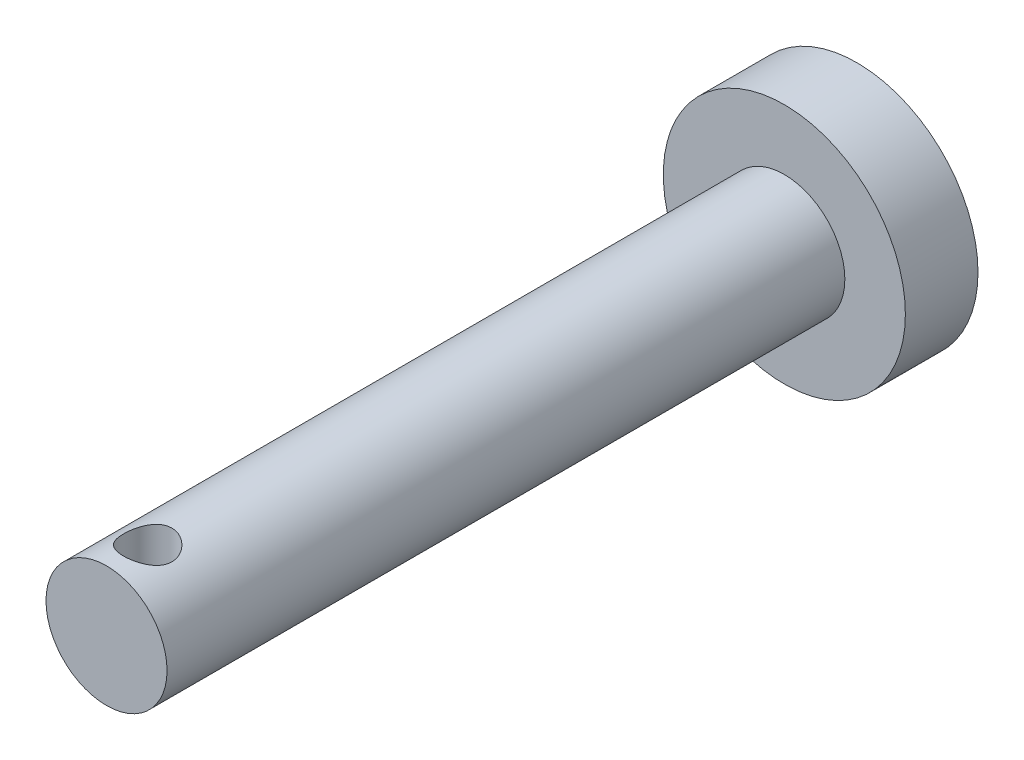
ISO-10303-21;
HEADER;
FILE_DESCRIPTION(('STEP AP214'),'2;1');
FILE_NAME('part.step','',(''),(''),'','','');
FILE_SCHEMA(('AUTOMOTIVE_DESIGN { 1 0 10303 214 1 1 1 1 }'));
ENDSEC;
DATA;
#1=APPLICATION_CONTEXT('core data for automotive mechanical design processes');
#2=APPLICATION_PROTOCOL_DEFINITION('international standard','automotive_design',2000,#1);
#3=PRODUCT_CONTEXT('',#1,'mechanical');
#4=PRODUCT('Part','Part','',(#3));
#5=PRODUCT_RELATED_PRODUCT_CATEGORY('part','',(#4));
#6=PRODUCT_DEFINITION_FORMATION('','',#4);
#7=PRODUCT_DEFINITION_CONTEXT('part definition',#1,'design');
#8=PRODUCT_DEFINITION('design','',#6,#7);
#9=PRODUCT_DEFINITION_SHAPE('','',#8);
#10=(LENGTH_UNIT() NAMED_UNIT(*) SI_UNIT(.MILLI.,.METRE.));
#11=(NAMED_UNIT(*) PLANE_ANGLE_UNIT() SI_UNIT($,.RADIAN.));
#12=(NAMED_UNIT(*) SI_UNIT($,.STERADIAN.) SOLID_ANGLE_UNIT());
#13=UNCERTAINTY_MEASURE_WITH_UNIT(LENGTH_MEASURE(1.E-05),#10,'distance_accuracy_value','');
#14=(GEOMETRIC_REPRESENTATION_CONTEXT(3) GLOBAL_UNCERTAINTY_ASSIGNED_CONTEXT((#13)) GLOBAL_UNIT_ASSIGNED_CONTEXT((#10,
#11,#12)) REPRESENTATION_CONTEXT('',''));
#15=CARTESIAN_POINT('',(0.,0.,0.));
#16=DIRECTION('',(0.,0.,1.));
#17=DIRECTION('',(1.,0.,0.));
#18=AXIS2_PLACEMENT_3D('',#15,#16,#17);
#19=CARTESIAN_POINT('',(0.,0.,-80.));
#20=DIRECTION('',(0.,0.,1.));
#21=DIRECTION('',(1.,0.,0.));
#22=AXIS2_PLACEMENT_3D('',#19,#20,#21);
#23=PLANE('',#22);
#24=CARTESIAN_POINT('',(0.,0.,-80.));
#25=DIRECTION('',(0.,0.,1.));
#26=DIRECTION('',(1.,0.,0.));
#27=AXIS2_PLACEMENT_3D('',#24,#25,#26);
#28=CIRCLE('',#27,5.);
#29=CARTESIAN_POINT('',(5.,0.,-80.));
#30=VERTEX_POINT('',#29);
#31=EDGE_CURVE('E10',#30,#30,#28,.T.);
#32=ORIENTED_EDGE('',*,*,#31,.F.);
#33=EDGE_LOOP('',(#32));
#34=FACE_BOUND('',#33,.T.);
#35=ADVANCED_FACE('F31',(#34),#23,.F.);
#36=CARTESIAN_POINT('',(0.,0.,80.));
#37=DIRECTION('',(0.,0.,1.));
#38=DIRECTION('',(1.,0.,0.));
#39=AXIS2_PLACEMENT_3D('',#36,#37,#38);
#40=CYLINDRICAL_SURFACE('',#39,5.);
#41=CARTESIAN_POINT('',(0.,0.,-77.));
#42=DIRECTION('',(0.,0.,1.));
#43=DIRECTION('',(1.,0.,0.));
#44=AXIS2_PLACEMENT_3D('',#41,#42,#43);
#45=CIRCLE('',#44,5.);
#46=CARTESIAN_POINT('',(5.,0.,-77.));
#47=VERTEX_POINT('',#46);
#48=EDGE_CURVE('E43',#47,#47,#45,.T.);
#49=ORIENTED_EDGE('',*,*,#48,.F.);
#50=EDGE_LOOP('',(#49));
#51=FACE_BOUND('',#50,.T.);
#52=ORIENTED_EDGE('',*,*,#31,.T.);
#53=EDGE_LOOP('',(#52));
#54=FACE_BOUND('',#53,.T.);
#55=ADVANCED_FACE('F79',(#51,#54),#40,.T.);
#56=CARTESIAN_POINT('',(0.,5.,-77.));
#57=DIRECTION('',(0.,0.,-1.));
#58=DIRECTION('',(-1.,0.,0.));
#59=AXIS2_PLACEMENT_3D('',#56,#57,#58);
#60=PLANE('',#59);
#61=CARTESIAN_POINT('',(0.,0.,-77.));
#62=DIRECTION('',(0.,0.,1.));
#63=DIRECTION('',(1.,0.,0.));
#64=AXIS2_PLACEMENT_3D('',#61,#62,#63);
#65=CIRCLE('',#64,2.50000000000002);
#66=CARTESIAN_POINT('',(2.50000000000002,0.,-77.));
#67=VERTEX_POINT('',#66);
#68=EDGE_CURVE('E48',#67,#67,#65,.T.);
#69=ORIENTED_EDGE('',*,*,#68,.F.);
#70=EDGE_LOOP('',(#69));
#71=FACE_BOUND('',#70,.T.);
#72=ORIENTED_EDGE('',*,*,#48,.T.);
#73=EDGE_LOOP('',(#72));
#74=FACE_BOUND('',#73,.T.);
#75=ADVANCED_FACE('F75',(#71,#74),#60,.F.);
#76=CARTESIAN_POINT('',(0.,0.,80.));
#77=DIRECTION('',(0.,0.,1.));
#78=DIRECTION('',(1.,0.,0.));
#79=AXIS2_PLACEMENT_3D('',#76,#77,#78);
#80=CYLINDRICAL_SURFACE('',#79,2.50000000000001);
#81=CARTESIAN_POINT('',(0.,-2.50000000000001,-49.7));
#82=CARTESIAN_POINT('',(0.0537465027214461,-2.49999635613543,-49.7000049259119));
#83=CARTESIAN_POINT('',(0.107586282045338,-2.49824647153467,-49.7043588760442));
#84=CARTESIAN_POINT('',(0.213748240208949,-2.49141726550322,-49.7216238517606));
#85=CARTESIAN_POINT('',(0.266065888780625,-2.4863288934944,-49.7345581395431));
#86=CARTESIAN_POINT('',(0.367476961363703,-2.4733710460656,-49.7684380390294));
#87=CARTESIAN_POINT('',(0.416580330808481,-2.46551068182037,-49.7893574231084));
#88=CARTESIAN_POINT('',(0.510535985164186,-2.4477830539804,-49.8385095866633));
#89=CARTESIAN_POINT('',(0.555389738375498,-2.43791648729029,-49.8667398274595));
#90=CARTESIAN_POINT('',(0.641750503785199,-2.4166544308521,-49.9311177492805));
#91=CARTESIAN_POINT('',(0.683031136275109,-2.40521148464596,-49.9675533281201));
#92=CARTESIAN_POINT('',(0.759087502392363,-2.38230288453098,-50.0467000017384));
#93=CARTESIAN_POINT('',(0.793860053566767,-2.37083722226897,-50.0894141486059));
#94=CARTESIAN_POINT('',(0.857437283646442,-2.34861395898569,-50.1822140351211));
#95=CARTESIAN_POINT('',(0.88590749059774,-2.33791057982477,-50.2325432430116));
#96=CARTESIAN_POINT('',(0.933877359518577,-2.31916823593397,-50.33776819921));
#97=CARTESIAN_POINT('',(0.953381282142919,-2.31112800622089,-50.3926617639242));
#98=CARTESIAN_POINT('',(0.981949411697935,-2.2991317883041,-50.5028561667961));
#99=CARTESIAN_POINT('',(0.991446982902825,-2.29500710177803,-50.5580256177881));
#100=CARTESIAN_POINT('',(1.00108648082002,-2.29082002024573,-50.6693174991536));
#101=CARTESIAN_POINT('',(1.00123300815661,-2.29075562761385,-50.7254394473125));
#102=CARTESIAN_POINT('',(0.992494683752273,-2.29455250139998,-50.832878335729));
#103=CARTESIAN_POINT('',(0.984237657152569,-2.29814087519226,-50.8842578572045));
#104=CARTESIAN_POINT('',(0.95997344014891,-2.30838093803919,-50.9848297780034));
#105=CARTESIAN_POINT('',(0.943964897402316,-2.31503316160837,-51.0340217940551));
#106=CARTESIAN_POINT('',(0.904347366275536,-2.33079742544266,-51.130008918098));
#107=CARTESIAN_POINT('',(0.880589931157657,-2.33995689640395,-51.1767346195273));
#108=CARTESIAN_POINT('',(0.826253230366104,-2.35969058194946,-51.2657079081808));
#109=CARTESIAN_POINT('',(0.79567140255042,-2.37026532728425,-51.3079538047014));
#110=CARTESIAN_POINT('',(0.725775299727214,-2.39263368371136,-51.390204864401));
#111=CARTESIAN_POINT('',(0.685968731485313,-2.40445832488077,-51.429784364723));
#112=CARTESIAN_POINT('',(0.600157213715091,-2.42729912479142,-51.501842239001));
#113=CARTESIAN_POINT('',(0.554151032667213,-2.43831512222663,-51.5343191987051));
#114=CARTESIAN_POINT('',(0.45603882630292,-2.45857340632275,-51.5918087237079));
#115=CARTESIAN_POINT('',(0.403830245673238,-2.46777635047708,-51.6166611405985));
#116=CARTESIAN_POINT('',(0.295511882741442,-2.4830741416438,-51.657083930539));
#117=CARTESIAN_POINT('',(0.239404098424838,-2.48917056731192,-51.6726590187787));
#118=CARTESIAN_POINT('',(0.128447943803911,-2.49728069753456,-51.6932241477098));
#119=CARTESIAN_POINT('',(0.0737216469927681,-2.49951472916758,-51.6987862271268));
#120=CARTESIAN_POINT('',(-0.0359226549039086,-2.50034239255317,-51.7008565502643));
#121=CARTESIAN_POINT('',(-0.0908406066119627,-2.49893696791147,-51.6973671407738));
#122=CARTESIAN_POINT('',(-0.196716369560995,-2.49278783531877,-51.681854123724));
#123=CARTESIAN_POINT('',(-0.247741245887738,-2.48819695672763,-51.6702210098245));
#124=CARTESIAN_POINT('',(-0.347067714030391,-2.47629720702751,-51.6392821458451));
#125=CARTESIAN_POINT('',(-0.395368955112424,-2.46898798678266,-51.6199754101657));
#126=CARTESIAN_POINT('',(-0.489539392908353,-2.45208297385407,-51.57360753016));
#127=CARTESIAN_POINT('',(-0.535289011377704,-2.44242407989903,-51.5463272639784));
#128=CARTESIAN_POINT('',(-0.621721795623279,-2.42186682372763,-51.4850298380472));
#129=CARTESIAN_POINT('',(-0.662402920380564,-2.41096796555136,-51.4510099785387));
#130=CARTESIAN_POINT('',(-0.740361521514411,-2.38822558819057,-51.3745649935252));
#131=CARTESIAN_POINT('',(-0.777236966903033,-2.37636720712527,-51.3317332292469));
#132=CARTESIAN_POINT('',(-0.843375598706857,-2.35370836458567,-51.2402799584953));
#133=CARTESIAN_POINT('',(-0.872637530668756,-2.34290807763256,-51.19165749983));
#134=CARTESIAN_POINT('',(-0.922903750965815,-2.32357149953855,-51.0892691527029));
#135=CARTESIAN_POINT('',(-0.943825297267227,-2.31505815442395,-51.0354580003938));
#136=CARTESIAN_POINT('',(-0.976148109852652,-2.30161836738967,-50.9246331741424));
#137=CARTESIAN_POINT('',(-0.987556402634658,-2.29668927848,-50.8676218970938));
#138=CARTESIAN_POINT('',(-0.999857808639202,-2.29135879649964,-50.7564360491127));
#139=CARTESIAN_POINT('',(-1.00144854115143,-2.29065710504087,-50.7023525802033));
#140=CARTESIAN_POINT('',(-0.995901579638763,-2.2930741801655,-50.5947275711433));
#141=CARTESIAN_POINT('',(-0.988764993956892,-2.29619246162398,-50.5411859630487));
#142=CARTESIAN_POINT('',(-0.966535683076825,-2.30563324539511,-50.4383339050725));
#143=CARTESIAN_POINT('',(-0.951768746785488,-2.31182415913726,-50.3889398627835));
#144=CARTESIAN_POINT('',(-0.915002724245504,-2.32662000616349,-50.2933106851932));
#145=CARTESIAN_POINT('',(-0.893001640696905,-2.33522560603005,-50.2470764265501));
#146=CARTESIAN_POINT('',(-0.840936381379865,-2.35449304802247,-50.1561951903646));
#147=CARTESIAN_POINT('',(-0.810482667579744,-2.36524441156622,-50.1117906649347));
#148=CARTESIAN_POINT('',(-0.742946059635746,-2.3873190218612,-50.0285033413981));
#149=CARTESIAN_POINT('',(-0.705861167409058,-2.39864244024204,-49.9896222139358));
#150=CARTESIAN_POINT('',(-0.62325275313623,-2.42146783543698,-49.9158985733682));
#151=CARTESIAN_POINT('',(-0.577338000573069,-2.43293378981094,-49.881481346551));
#152=CARTESIAN_POINT('',(-0.47995016014289,-2.45400203356859,-49.8208314786892));
#153=CARTESIAN_POINT('',(-0.428474502273618,-2.46360345546454,-49.7946026439237));
#154=CARTESIAN_POINT('',(-0.322369031247599,-2.47969857407932,-49.7516888924049));
#155=CARTESIAN_POINT('',(-0.267815809109845,-2.48624681527515,-49.7348353382198));
#156=CARTESIAN_POINT('',(-0.156438273140607,-2.49572153104684,-49.7106804395229));
#157=CARTESIAN_POINT('',(-0.0996217629294528,-2.4986594974782,-49.703348781628));
#158=CARTESIAN_POINT('',(-0.0284561489454626,-2.49987949752069,-49.7003023095109));
#159=CARTESIAN_POINT('',(-0.0142313443703781,-2.50000096484589,-49.6999986956854));
#160=CARTESIAN_POINT('',(0.,-2.50000000000001,-49.7));
#161=B_SPLINE_CURVE_WITH_KNOTS('',3,(#81,#82,#83,#84,#85,#86,#87,#88,#89,#90,#91,#92,#93,#94,
#95,#96,#97,#98,#99,#100,#101,#102,#103,#104,#105,#106,#107,#108,#109,#110,#111,#112,#113,#114,
#115,#116,#117,#118,#119,#120,#121,#122,#123,#124,#125,#126,#127,#128,#129,#130,#131,#132,#133,
#134,#135,#136,#137,#138,#139,#140,#141,#142,#143,#144,#145,#146,#147,#148,#149,#150,#151,#152,
#153,#154,#155,#156,#157,#158,#159,#160),.UNSPECIFIED.,.T.,.F.,(4,2,2,2,2,2,2,2,2,2,2,2,2,2,2,2,
2,2,2,2,2,2,2,2,2,2,2,2,2,2,2,2,2,2,2,2,2,2,2,4),(0.,0.161201493946536,0.322841818003969,
0.483955728735794,0.645013767839925,0.812986908501991,0.981041974672059,1.15657629409609,
1.33202711559135,1.49952052654415,1.66693153170245,1.82269164200687,1.97847893628024,
2.13744563149409,2.29647210969092,2.46779174593279,2.63914546419867,2.81388456581403,
2.98853478056895,3.15284592264004,3.31711446785041,3.47400227782183,3.63091024496899,
3.79261756699131,3.95438979749485,4.12684237312207,4.29932334521874,4.47347522570413,
4.64749836322967,4.80899836696375,4.97047786281522,5.12557159274386,5.28070817902582,
5.44472734028347,5.60879600674197,5.78350211766918,5.95828931820267,6.1298215050666,
6.30080626202172,6.34349022948398),.UNSPECIFIED.);
#162=CARTESIAN_POINT('',(0.,-2.50000000000001,-49.7));
#163=VERTEX_POINT('',#162);
#164=EDGE_CURVE('E34',#163,#163,#161,.T.);
#165=ORIENTED_EDGE('',*,*,#164,.T.);
#166=EDGE_LOOP('',(#165));
#167=FACE_BOUND('',#166,.T.);
#168=CARTESIAN_POINT('',(0.,2.50000000000001,-49.7));
#169=CARTESIAN_POINT('',(-0.0537465027214461,2.49999635613543,-49.7000049259119));
#170=CARTESIAN_POINT('',(-0.107586282045338,2.49824647153467,-49.7043588760442));
#171=CARTESIAN_POINT('',(-0.213748240208949,2.49141726550322,-49.7216238517606));
#172=CARTESIAN_POINT('',(-0.266065888780625,2.4863288934944,-49.7345581395431));
#173=CARTESIAN_POINT('',(-0.367476961363703,2.4733710460656,-49.7684380390294));
#174=CARTESIAN_POINT('',(-0.416580330808481,2.46551068182037,-49.7893574231084));
#175=CARTESIAN_POINT('',(-0.510535985164186,2.4477830539804,-49.8385095866633));
#176=CARTESIAN_POINT('',(-0.555389738375498,2.43791648729029,-49.8667398274595));
#177=CARTESIAN_POINT('',(-0.641750503785199,2.4166544308521,-49.9311177492805));
#178=CARTESIAN_POINT('',(-0.683031136275109,2.40521148464596,-49.9675533281201));
#179=CARTESIAN_POINT('',(-0.759087502392363,2.38230288453098,-50.0467000017384));
#180=CARTESIAN_POINT('',(-0.793860053566767,2.37083722226897,-50.0894141486059));
#181=CARTESIAN_POINT('',(-0.857437283646442,2.34861395898569,-50.1822140351211));
#182=CARTESIAN_POINT('',(-0.88590749059774,2.33791057982477,-50.2325432430116));
#183=CARTESIAN_POINT('',(-0.933877359518577,2.31916823593397,-50.33776819921));
#184=CARTESIAN_POINT('',(-0.953381282142919,2.31112800622089,-50.3926617639242));
#185=CARTESIAN_POINT('',(-0.981949411697935,2.2991317883041,-50.5028561667961));
#186=CARTESIAN_POINT('',(-0.991446982902825,2.29500710177803,-50.5580256177881));
#187=CARTESIAN_POINT('',(-1.00108648082002,2.29082002024573,-50.6693174991536));
#188=CARTESIAN_POINT('',(-1.00123300815661,2.29075562761385,-50.7254394473125));
#189=CARTESIAN_POINT('',(-0.992494683752273,2.29455250139998,-50.832878335729));
#190=CARTESIAN_POINT('',(-0.984237657152569,2.29814087519226,-50.8842578572045));
#191=CARTESIAN_POINT('',(-0.95997344014891,2.30838093803919,-50.9848297780034));
#192=CARTESIAN_POINT('',(-0.943964897402316,2.31503316160837,-51.0340217940551));
#193=CARTESIAN_POINT('',(-0.904347366275536,2.33079742544266,-51.130008918098));
#194=CARTESIAN_POINT('',(-0.880589931157657,2.33995689640395,-51.1767346195273));
#195=CARTESIAN_POINT('',(-0.826253230366104,2.35969058194946,-51.2657079081808));
#196=CARTESIAN_POINT('',(-0.79567140255042,2.37026532728425,-51.3079538047014));
#197=CARTESIAN_POINT('',(-0.725775299727214,2.39263368371136,-51.390204864401));
#198=CARTESIAN_POINT('',(-0.685968731485313,2.40445832488077,-51.429784364723));
#199=CARTESIAN_POINT('',(-0.600157213715091,2.42729912479142,-51.501842239001));
#200=CARTESIAN_POINT('',(-0.554151032667213,2.43831512222663,-51.5343191987051));
#201=CARTESIAN_POINT('',(-0.45603882630292,2.45857340632275,-51.5918087237079));
#202=CARTESIAN_POINT('',(-0.403830245673238,2.46777635047708,-51.6166611405985));
#203=CARTESIAN_POINT('',(-0.295511882741442,2.4830741416438,-51.657083930539));
#204=CARTESIAN_POINT('',(-0.239404098424838,2.48917056731192,-51.6726590187787));
#205=CARTESIAN_POINT('',(-0.128447943803911,2.49728069753456,-51.6932241477098));
#206=CARTESIAN_POINT('',(-0.0737216469927681,2.49951472916758,-51.6987862271268));
#207=CARTESIAN_POINT('',(0.0359226549039086,2.50034239255317,-51.7008565502643));
#208=CARTESIAN_POINT('',(0.0908406066119627,2.49893696791147,-51.6973671407738));
#209=CARTESIAN_POINT('',(0.196716369560995,2.49278783531877,-51.681854123724));
#210=CARTESIAN_POINT('',(0.247741245887738,2.48819695672763,-51.6702210098245));
#211=CARTESIAN_POINT('',(0.347067714030391,2.47629720702751,-51.6392821458451));
#212=CARTESIAN_POINT('',(0.395368955112424,2.46898798678266,-51.6199754101657));
#213=CARTESIAN_POINT('',(0.489539392908353,2.45208297385407,-51.57360753016));
#214=CARTESIAN_POINT('',(0.535289011377704,2.44242407989903,-51.5463272639784));
#215=CARTESIAN_POINT('',(0.621721795623279,2.42186682372763,-51.4850298380472));
#216=CARTESIAN_POINT('',(0.662402920380564,2.41096796555136,-51.4510099785387));
#217=CARTESIAN_POINT('',(0.740361521514411,2.38822558819057,-51.3745649935252));
#218=CARTESIAN_POINT('',(0.777236966903033,2.37636720712527,-51.3317332292469));
#219=CARTESIAN_POINT('',(0.843375598706857,2.35370836458567,-51.2402799584953));
#220=CARTESIAN_POINT('',(0.872637530668756,2.34290807763256,-51.19165749983));
#221=CARTESIAN_POINT('',(0.922903750965815,2.32357149953855,-51.0892691527029));
#222=CARTESIAN_POINT('',(0.943825297267227,2.31505815442395,-51.0354580003938));
#223=CARTESIAN_POINT('',(0.976148109852652,2.30161836738967,-50.9246331741424));
#224=CARTESIAN_POINT('',(0.987556402634658,2.29668927848,-50.8676218970938));
#225=CARTESIAN_POINT('',(0.999857808639202,2.29135879649964,-50.7564360491127));
#226=CARTESIAN_POINT('',(1.00144854115143,2.29065710504087,-50.7023525802033));
#227=CARTESIAN_POINT('',(0.995901579638763,2.2930741801655,-50.5947275711433));
#228=CARTESIAN_POINT('',(0.988764993956892,2.29619246162398,-50.5411859630487));
#229=CARTESIAN_POINT('',(0.966535683076825,2.30563324539511,-50.4383339050725));
#230=CARTESIAN_POINT('',(0.951768746785488,2.31182415913726,-50.3889398627835));
#231=CARTESIAN_POINT('',(0.915002724245504,2.32662000616349,-50.2933106851932));
#232=CARTESIAN_POINT('',(0.893001640696905,2.33522560603005,-50.2470764265501));
#233=CARTESIAN_POINT('',(0.840936381379865,2.35449304802247,-50.1561951903646));
#234=CARTESIAN_POINT('',(0.810482667579744,2.36524441156622,-50.1117906649347));
#235=CARTESIAN_POINT('',(0.742946059635746,2.3873190218612,-50.0285033413981));
#236=CARTESIAN_POINT('',(0.705861167409058,2.39864244024204,-49.9896222139358));
#237=CARTESIAN_POINT('',(0.62325275313623,2.42146783543698,-49.9158985733682));
#238=CARTESIAN_POINT('',(0.577338000573069,2.43293378981094,-49.881481346551));
#239=CARTESIAN_POINT('',(0.47995016014289,2.45400203356859,-49.8208314786892));
#240=CARTESIAN_POINT('',(0.428474502273618,2.46360345546454,-49.7946026439237));
#241=CARTESIAN_POINT('',(0.322369031247599,2.47969857407932,-49.7516888924049));
#242=CARTESIAN_POINT('',(0.267815809109845,2.48624681527515,-49.7348353382198));
#243=CARTESIAN_POINT('',(0.156438273140607,2.49572153104684,-49.7106804395229));
#244=CARTESIAN_POINT('',(0.0996217629294528,2.4986594974782,-49.703348781628));
#245=CARTESIAN_POINT('',(0.0284561489454626,2.49987949752069,-49.7003023095109));
#246=CARTESIAN_POINT('',(0.0142313443703781,2.50000096484589,-49.6999986956854));
#247=CARTESIAN_POINT('',(0.,2.50000000000001,-49.7));
#248=B_SPLINE_CURVE_WITH_KNOTS('',3,(#168,#169,#170,#171,#172,#173,#174,#175,#176,#177,#178,
#179,#180,#181,#182,#183,#184,#185,#186,#187,#188,#189,#190,#191,#192,#193,#194,#195,#196,#197,
#198,#199,#200,#201,#202,#203,#204,#205,#206,#207,#208,#209,#210,#211,#212,#213,#214,#215,#216,
#217,#218,#219,#220,#221,#222,#223,#224,#225,#226,#227,#228,#229,#230,#231,#232,#233,#234,#235,
#236,#237,#238,#239,#240,#241,#242,#243,#244,#245,#246,#247),.UNSPECIFIED.,.T.,.F.,(4,2,2,2,2,2,
2,2,2,2,2,2,2,2,2,2,2,2,2,2,2,2,2,2,2,2,2,2,2,2,2,2,2,2,2,2,2,2,2,4),(0.,0.161201493946536,
0.322841818003969,0.483955728735794,0.645013767839925,0.812986908501991,0.981041974672059,
1.15657629409609,1.33202711559135,1.49952052654415,1.66693153170245,1.82269164200687,
1.97847893628024,2.13744563149409,2.29647210969092,2.46779174593279,2.63914546419867,
2.81388456581403,2.98853478056895,3.15284592264004,3.31711446785041,3.47400227782183,
3.63091024496899,3.79261756699131,3.95438979749485,4.12684237312207,4.29932334521874,
4.47347522570413,4.64749836322967,4.80899836696375,4.97047786281522,5.12557159274386,
5.28070817902582,5.44472734028347,5.60879600674197,5.78350211766918,5.95828931820267,
6.1298215050666,6.30080626202172,6.34349022948398),.UNSPECIFIED.);
#249=CARTESIAN_POINT('',(0.,2.50000000000001,-49.7));
#250=VERTEX_POINT('',#249);
#251=EDGE_CURVE('E54',#250,#250,#248,.T.);
#252=ORIENTED_EDGE('',*,*,#251,.T.);
#253=EDGE_LOOP('',(#252));
#254=FACE_BOUND('',#253,.T.);
#255=CARTESIAN_POINT('',(0.,0.,-49.));
#256=DIRECTION('',(0.,0.,-1.));
#257=DIRECTION('',(-1.,0.,0.));
#258=AXIS2_PLACEMENT_3D('',#255,#256,#257);
#259=CIRCLE('',#258,2.50000000000001);
#260=CARTESIAN_POINT('',(-2.50000000000001,0.,-49.));
#261=VERTEX_POINT('',#260);
#262=EDGE_CURVE('E52',#261,#261,#259,.T.);
#263=ORIENTED_EDGE('',*,*,#262,.T.);
#264=EDGE_LOOP('',(#263));
#265=FACE_BOUND('',#264,.T.);
#266=ORIENTED_EDGE('',*,*,#68,.T.);
#267=EDGE_LOOP('',(#266));
#268=FACE_BOUND('',#267,.T.);
#269=ADVANCED_FACE('F59',(#167,#254,#265,#268),#80,.T.);
#270=CARTESIAN_POINT('',(-5.,5.74688247345988,-49.));
#271=DIRECTION('',(0.,0.,-1.));
#272=DIRECTION('',(-1.,0.,0.));
#273=AXIS2_PLACEMENT_3D('',#270,#271,#272);
#274=PLANE('',#273);
#275=ORIENTED_EDGE('',*,*,#262,.F.);
#276=EDGE_LOOP('',(#275));
#277=FACE_BOUND('',#276,.T.);
#278=ADVANCED_FACE('F66',(#277),#274,.F.);
#279=CARTESIAN_POINT('',(0.,-5.,-50.7));
#280=DIRECTION('',(0.,1.,0.));
#281=DIRECTION('',(0.,0.,1.));
#282=AXIS2_PLACEMENT_3D('',#279,#280,#281);
#283=CYLINDRICAL_SURFACE('',#282,1.);
#284=ORIENTED_EDGE('',*,*,#251,.F.);
#285=EDGE_LOOP('',(#284));
#286=FACE_BOUND('',#285,.T.);
#287=ORIENTED_EDGE('',*,*,#164,.F.);
#288=EDGE_LOOP('',(#287));
#289=FACE_BOUND('',#288,.T.);
#290=ADVANCED_FACE('F63',(#286,#289),#283,.F.);
#291=CLOSED_SHELL('',(#35,#55,#75,#269,#278,#290));
#292=MANIFOLD_SOLID_BREP('B2',#291);
#293=ADVANCED_BREP_SHAPE_REPRESENTATION('',(#18,#292),#14);
#294=SHAPE_DEFINITION_REPRESENTATION(#9,#293);
ENDSEC;
END-ISO-10303-21;
